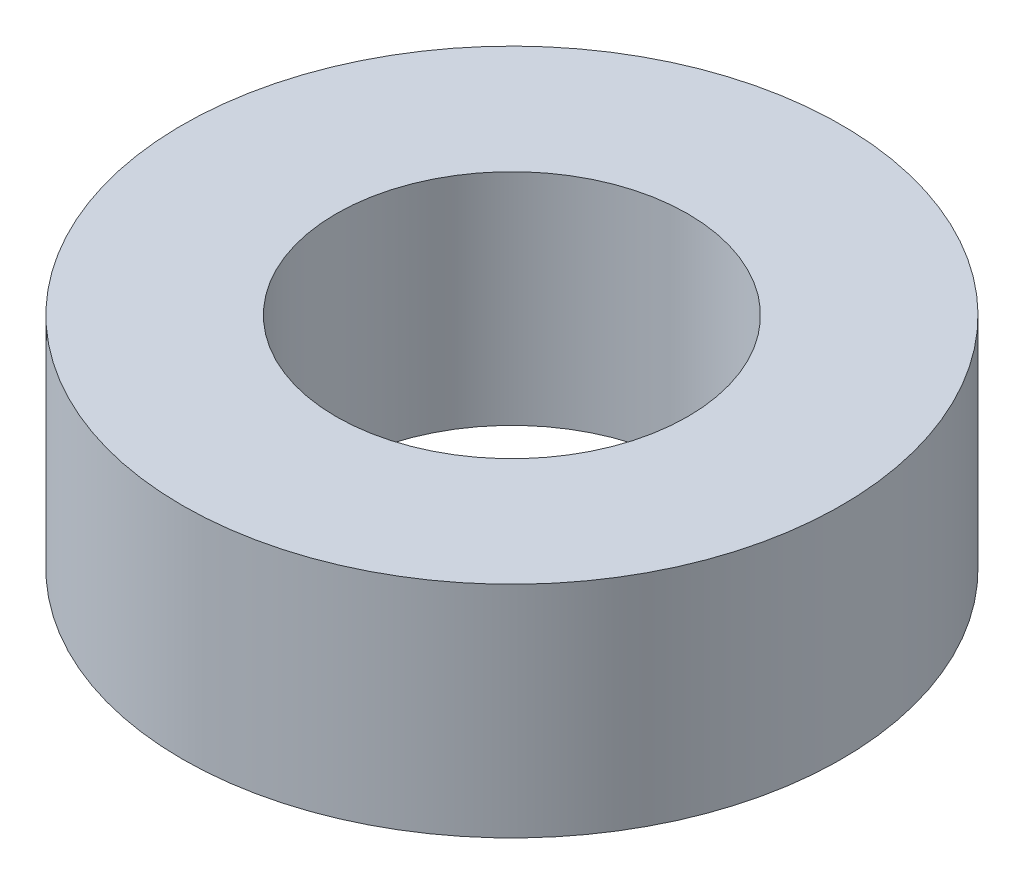
ISO-10303-21;
HEADER;
FILE_DESCRIPTION(('STEP AP214'),'2;1');
FILE_NAME('part.step','',(''),(''),'','','');
FILE_SCHEMA(('AUTOMOTIVE_DESIGN { 1 0 10303 214 1 1 1 1 }'));
ENDSEC;
DATA;
#1=APPLICATION_CONTEXT('core data for automotive mechanical design processes');
#2=APPLICATION_PROTOCOL_DEFINITION('international standard','automotive_design',2000,#1);
#3=PRODUCT_CONTEXT('',#1,'mechanical');
#4=PRODUCT('Part','Part','',(#3));
#5=PRODUCT_RELATED_PRODUCT_CATEGORY('part','',(#4));
#6=PRODUCT_DEFINITION_FORMATION('','',#4);
#7=PRODUCT_DEFINITION_CONTEXT('part definition',#1,'design');
#8=PRODUCT_DEFINITION('design','',#6,#7);
#9=PRODUCT_DEFINITION_SHAPE('','',#8);
#10=(LENGTH_UNIT() NAMED_UNIT(*) SI_UNIT(.MILLI.,.METRE.));
#11=(NAMED_UNIT(*) PLANE_ANGLE_UNIT() SI_UNIT($,.RADIAN.));
#12=(NAMED_UNIT(*) SI_UNIT($,.STERADIAN.) SOLID_ANGLE_UNIT());
#13=UNCERTAINTY_MEASURE_WITH_UNIT(LENGTH_MEASURE(1.E-05),#10,'distance_accuracy_value','');
#14=(GEOMETRIC_REPRESENTATION_CONTEXT(3) GLOBAL_UNCERTAINTY_ASSIGNED_CONTEXT((#13)) GLOBAL_UNIT_ASSIGNED_CONTEXT((#10,
#11,#12)) REPRESENTATION_CONTEXT('',''));
#15=CARTESIAN_POINT('',(0.,0.,0.));
#16=DIRECTION('',(0.,0.,1.));
#17=DIRECTION('',(1.,0.,0.));
#18=AXIS2_PLACEMENT_3D('',#15,#16,#17);
#19=CARTESIAN_POINT('',(0.,5.08,0.));
#20=DIRECTION('',(0.,-1.,0.));
#21=DIRECTION('',(0.,0.,-1.));
#22=AXIS2_PLACEMENT_3D('',#19,#20,#21);
#23=CYLINDRICAL_SURFACE('',#22,7.62);
#24=CARTESIAN_POINT('',(0.,5.08,0.));
#25=DIRECTION('',(0.,1.,0.));
#26=DIRECTION('',(0.,0.,1.));
#27=AXIS2_PLACEMENT_3D('',#24,#25,#26);
#28=CIRCLE('',#27,7.62);
#29=CARTESIAN_POINT('',(0.,5.08,7.62));
#30=VERTEX_POINT('',#29);
#31=EDGE_CURVE('E10',#30,#30,#28,.T.);
#32=ORIENTED_EDGE('',*,*,#31,.F.);
#33=EDGE_LOOP('',(#32));
#34=FACE_BOUND('',#33,.T.);
#35=CARTESIAN_POINT('',(0.,0.,0.));
#36=DIRECTION('',(0.,1.,0.));
#37=DIRECTION('',(0.,0.,1.));
#38=AXIS2_PLACEMENT_3D('',#35,#36,#37);
#39=CIRCLE('',#38,7.62);
#40=CARTESIAN_POINT('',(0.,0.,7.62));
#41=VERTEX_POINT('',#40);
#42=EDGE_CURVE('E40',#41,#41,#39,.T.);
#43=ORIENTED_EDGE('',*,*,#42,.T.);
#44=EDGE_LOOP('',(#43));
#45=FACE_BOUND('',#44,.T.);
#46=ADVANCED_FACE('F37',(#34,#45),#23,.T.);
#47=CARTESIAN_POINT('',(0.,5.08,0.));
#48=DIRECTION('',(0.,1.,0.));
#49=DIRECTION('',(0.,0.,1.));
#50=AXIS2_PLACEMENT_3D('',#47,#48,#49);
#51=PLANE('',#50);
#52=CARTESIAN_POINT('',(0.,5.08,0.));
#53=DIRECTION('',(0.,1.,0.));
#54=DIRECTION('',(0.,0.,1.));
#55=AXIS2_PLACEMENT_3D('',#52,#53,#54);
#56=CIRCLE('',#55,4.064);
#57=CARTESIAN_POINT('',(0.,5.08,4.064));
#58=VERTEX_POINT('',#57);
#59=EDGE_CURVE('E51',#58,#58,#56,.T.);
#60=ORIENTED_EDGE('',*,*,#59,.F.);
#61=EDGE_LOOP('',(#60));
#62=FACE_BOUND('',#61,.T.);
#63=ORIENTED_EDGE('',*,*,#31,.T.);
#64=EDGE_LOOP('',(#63));
#65=FACE_BOUND('',#64,.T.);
#66=ADVANCED_FACE('F68',(#62,#65),#51,.T.);
#67=CARTESIAN_POINT('',(0.,0.,0.));
#68=DIRECTION('',(0.,1.,0.));
#69=DIRECTION('',(0.,0.,1.));
#70=AXIS2_PLACEMENT_3D('',#67,#68,#69);
#71=PLANE('',#70);
#72=CARTESIAN_POINT('',(0.,0.,0.));
#73=DIRECTION('',(0.,1.,0.));
#74=DIRECTION('',(0.,0.,1.));
#75=AXIS2_PLACEMENT_3D('',#72,#73,#74);
#76=CIRCLE('',#75,4.064);
#77=CARTESIAN_POINT('',(0.,0.,4.064));
#78=VERTEX_POINT('',#77);
#79=EDGE_CURVE('E49',#78,#78,#76,.T.);
#80=ORIENTED_EDGE('',*,*,#79,.T.);
#81=EDGE_LOOP('',(#80));
#82=FACE_BOUND('',#81,.T.);
#83=ORIENTED_EDGE('',*,*,#42,.F.);
#84=EDGE_LOOP('',(#83));
#85=FACE_BOUND('',#84,.T.);
#86=ADVANCED_FACE('F59',(#82,#85),#71,.F.);
#87=CARTESIAN_POINT('',(0.,0.,0.));
#88=DIRECTION('',(0.,1.,0.));
#89=DIRECTION('',(0.,0.,1.));
#90=AXIS2_PLACEMENT_3D('',#87,#88,#89);
#91=CYLINDRICAL_SURFACE('',#90,4.064);
#92=ORIENTED_EDGE('',*,*,#79,.F.);
#93=EDGE_LOOP('',(#92));
#94=FACE_BOUND('',#93,.T.);
#95=ORIENTED_EDGE('',*,*,#59,.T.);
#96=EDGE_LOOP('',(#95));
#97=FACE_BOUND('',#96,.T.);
#98=ADVANCED_FACE('F62',(#94,#97),#91,.F.);
#99=CLOSED_SHELL('',(#46,#66,#86,#98));
#100=MANIFOLD_SOLID_BREP('B2',#99);
#101=ADVANCED_BREP_SHAPE_REPRESENTATION('',(#18,#100),#14);
#102=SHAPE_DEFINITION_REPRESENTATION(#9,#101);
ENDSEC;
END-ISO-10303-21;
